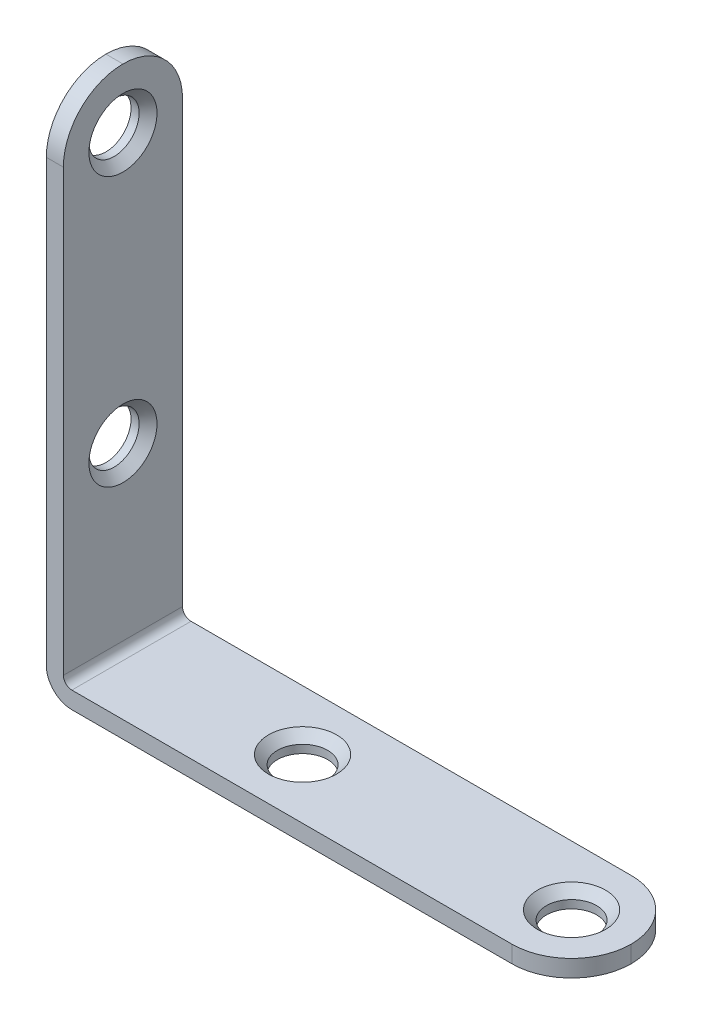
ISO-10303-21;
HEADER;
FILE_DESCRIPTION(('STEP AP214'),'2;1');
FILE_NAME('part.step','',(''),(''),'','','');
FILE_SCHEMA(('AUTOMOTIVE_DESIGN { 1 0 10303 214 1 1 1 1 }'));
ENDSEC;
DATA;
#1=APPLICATION_CONTEXT('core data for automotive mechanical design processes');
#2=APPLICATION_PROTOCOL_DEFINITION('international standard','automotive_design',2000,#1);
#3=PRODUCT_CONTEXT('',#1,'mechanical');
#4=PRODUCT('Part','Part','',(#3));
#5=PRODUCT_RELATED_PRODUCT_CATEGORY('part','',(#4));
#6=PRODUCT_DEFINITION_FORMATION('','',#4);
#7=PRODUCT_DEFINITION_CONTEXT('part definition',#1,'design');
#8=PRODUCT_DEFINITION('design','',#6,#7);
#9=PRODUCT_DEFINITION_SHAPE('','',#8);
#10=(LENGTH_UNIT() NAMED_UNIT(*) SI_UNIT(.MILLI.,.METRE.));
#11=(NAMED_UNIT(*) PLANE_ANGLE_UNIT() SI_UNIT($,.RADIAN.));
#12=(NAMED_UNIT(*) SI_UNIT($,.STERADIAN.) SOLID_ANGLE_UNIT());
#13=UNCERTAINTY_MEASURE_WITH_UNIT(LENGTH_MEASURE(1.E-05),#10,'distance_accuracy_value','');
#14=(GEOMETRIC_REPRESENTATION_CONTEXT(3) GLOBAL_UNCERTAINTY_ASSIGNED_CONTEXT((#13)) GLOBAL_UNIT_ASSIGNED_CONTEXT((#10,
#11,#12)) REPRESENTATION_CONTEXT('',''));
#15=CARTESIAN_POINT('',(0.,0.,0.));
#16=DIRECTION('',(0.,0.,1.));
#17=DIRECTION('',(1.,0.,0.));
#18=AXIS2_PLACEMENT_3D('',#15,#16,#17);
#19=CARTESIAN_POINT('',(2.,3.00000000000001,7.));
#20=DIRECTION('',(-1.,0.,0.));
#21=DIRECTION('',(0.,0.,1.));
#22=AXIS2_PLACEMENT_3D('',#19,#20,#21);
#23=PLANE('',#22);
#24=CARTESIAN_POINT('',(2.,54.7,0.));
#25=DIRECTION('',(1.,0.,0.));
#26=DIRECTION('',(0.,0.,-1.));
#27=AXIS2_PLACEMENT_3D('',#24,#25,#26);
#28=CIRCLE('',#27,4.);
#29=CARTESIAN_POINT('',(2.,54.7,-4.));
#30=VERTEX_POINT('',#29);
#31=EDGE_CURVE('E237',#30,#30,#28,.T.);
#32=ORIENTED_EDGE('',*,*,#31,.F.);
#33=EDGE_LOOP('',(#32));
#34=FACE_BOUND('',#33,.T.);
#35=DIRECTION('',(0.,1.,0.));
#36=VECTOR('',#35,1.);
#37=CARTESIAN_POINT('',(2.,3.00000000000001,-7.));
#38=LINE('',#37,#36);
#39=CARTESIAN_POINT('',(2.,3.00000000000001,-7.));
#40=VERTEX_POINT('',#39);
#41=CARTESIAN_POINT('',(2.,54.7,-7.));
#42=VERTEX_POINT('',#41);
#43=EDGE_CURVE('E131',#40,#42,#38,.T.);
#44=ORIENTED_EDGE('',*,*,#43,.T.);
#45=CARTESIAN_POINT('',(2.,54.7,0.));
#46=DIRECTION('',(-1.,0.,0.));
#47=DIRECTION('',(0.,0.,1.));
#48=AXIS2_PLACEMENT_3D('',#45,#46,#47);
#49=CIRCLE('',#48,7.);
#50=CARTESIAN_POINT('',(2.,61.7,0.));
#51=VERTEX_POINT('',#50);
#52=EDGE_CURVE('E13',#42,#51,#49,.F.);
#53=ORIENTED_EDGE('',*,*,#52,.T.);
#54=CARTESIAN_POINT('',(2.,54.7,0.));
#55=DIRECTION('',(-1.,0.,0.));
#56=DIRECTION('',(0.,0.,1.));
#57=AXIS2_PLACEMENT_3D('',#54,#55,#56);
#58=CIRCLE('',#57,7.);
#59=CARTESIAN_POINT('',(2.,54.7,7.));
#60=VERTEX_POINT('',#59);
#61=EDGE_CURVE('E54',#51,#60,#58,.F.);
#62=ORIENTED_EDGE('',*,*,#61,.T.);
#63=DIRECTION('',(0.,1.,0.));
#64=VECTOR('',#63,1.);
#65=CARTESIAN_POINT('',(2.,3.00000000000001,7.));
#66=LINE('',#65,#64);
#67=CARTESIAN_POINT('',(2.,3.00000000000001,7.));
#68=VERTEX_POINT('',#67);
#69=EDGE_CURVE('E155',#68,#60,#66,.T.);
#70=ORIENTED_EDGE('',*,*,#69,.F.);
#71=DIRECTION('',(0.,0.,-1.));
#72=VECTOR('',#71,1.);
#73=CARTESIAN_POINT('',(2.,3.00000000000001,7.));
#74=LINE('',#73,#72);
#75=EDGE_CURVE('E157',#68,#40,#74,.T.);
#76=ORIENTED_EDGE('',*,*,#75,.T.);
#77=EDGE_LOOP('',(#44,#53,#62,#70,#76));
#78=FACE_BOUND('',#77,.T.);
#79=CARTESIAN_POINT('',(2.,23.1,0.));
#80=DIRECTION('',(1.,0.,0.));
#81=DIRECTION('',(0.,0.,-1.));
#82=AXIS2_PLACEMENT_3D('',#79,#80,#81);
#83=CIRCLE('',#82,4.);
#84=CARTESIAN_POINT('',(2.,23.1,-4.));
#85=VERTEX_POINT('',#84);
#86=EDGE_CURVE('E228',#85,#85,#83,.T.);
#87=ORIENTED_EDGE('',*,*,#86,.F.);
#88=EDGE_LOOP('',(#87));
#89=FACE_BOUND('',#88,.T.);
#90=ADVANCED_FACE('F45',(#34,#78,#89),#23,.F.);
#91=CARTESIAN_POINT('',(0.,3.00000000000002,7.));
#92=DIRECTION('',(1.,0.,0.));
#93=DIRECTION('',(0.,0.,-1.));
#94=AXIS2_PLACEMENT_3D('',#91,#92,#93);
#95=PLANE('',#94);
#96=CARTESIAN_POINT('',(0.,54.7,0.));
#97=DIRECTION('',(1.,0.,0.));
#98=DIRECTION('',(0.,0.,-1.));
#99=AXIS2_PLACEMENT_3D('',#96,#97,#98);
#100=CIRCLE('',#99,2.95);
#101=CARTESIAN_POINT('',(0.,54.7,-2.95));
#102=VERTEX_POINT('',#101);
#103=EDGE_CURVE('E231',#102,#102,#100,.T.);
#104=ORIENTED_EDGE('',*,*,#103,.T.);
#105=EDGE_LOOP('',(#104));
#106=FACE_BOUND('',#105,.T.);
#107=CARTESIAN_POINT('',(0.,23.1,0.));
#108=DIRECTION('',(1.,0.,0.));
#109=DIRECTION('',(0.,0.,-1.));
#110=AXIS2_PLACEMENT_3D('',#107,#108,#109);
#111=CIRCLE('',#110,2.95);
#112=CARTESIAN_POINT('',(0.,23.1,-2.95000000000001));
#113=VERTEX_POINT('',#112);
#114=EDGE_CURVE('E222',#113,#113,#111,.T.);
#115=ORIENTED_EDGE('',*,*,#114,.T.);
#116=EDGE_LOOP('',(#115));
#117=FACE_BOUND('',#116,.T.);
#118=CARTESIAN_POINT('',(0.,54.7,0.));
#119=DIRECTION('',(1.,0.,0.));
#120=DIRECTION('',(0.,0.,-1.));
#121=AXIS2_PLACEMENT_3D('',#118,#119,#120);
#122=CIRCLE('',#121,7.);
#123=CARTESIAN_POINT('',(0.,54.7,7.));
#124=VERTEX_POINT('',#123);
#125=CARTESIAN_POINT('',(0.,61.7,0.));
#126=VERTEX_POINT('',#125);
#127=EDGE_CURVE('E68',#124,#126,#122,.F.);
#128=ORIENTED_EDGE('',*,*,#127,.T.);
#129=CARTESIAN_POINT('',(0.,54.7,0.));
#130=DIRECTION('',(1.,0.,0.));
#131=DIRECTION('',(0.,0.,-1.));
#132=AXIS2_PLACEMENT_3D('',#129,#130,#131);
#133=CIRCLE('',#132,7.);
#134=CARTESIAN_POINT('',(0.,54.7,-7.));
#135=VERTEX_POINT('',#134);
#136=EDGE_CURVE('E193',#126,#135,#133,.F.);
#137=ORIENTED_EDGE('',*,*,#136,.T.);
#138=DIRECTION('',(0.,-1.,0.));
#139=VECTOR('',#138,1.);
#140=CARTESIAN_POINT('',(0.,3.00000000000002,-7.));
#141=LINE('',#140,#139);
#142=CARTESIAN_POINT('',(0.,3.00000000000002,-7.));
#143=VERTEX_POINT('',#142);
#144=EDGE_CURVE('E137',#135,#143,#141,.T.);
#145=ORIENTED_EDGE('',*,*,#144,.T.);
#146=DIRECTION('',(0.,0.,-1.));
#147=VECTOR('',#146,1.);
#148=CARTESIAN_POINT('',(0.,3.00000000000002,7.));
#149=LINE('',#148,#147);
#150=CARTESIAN_POINT('',(0.,3.00000000000002,7.));
#151=VERTEX_POINT('',#150);
#152=EDGE_CURVE('E134',#151,#143,#149,.T.);
#153=ORIENTED_EDGE('',*,*,#152,.F.);
#154=DIRECTION('',(0.,-1.,0.));
#155=VECTOR('',#154,1.);
#156=CARTESIAN_POINT('',(0.,3.00000000000002,7.));
#157=LINE('',#156,#155);
#158=EDGE_CURVE('E121',#124,#151,#157,.T.);
#159=ORIENTED_EDGE('',*,*,#158,.F.);
#160=EDGE_LOOP('',(#128,#137,#145,#153,#159));
#161=FACE_BOUND('',#160,.T.);
#162=ADVANCED_FACE('F135',(#106,#117,#161),#95,.F.);
#163=CARTESIAN_POINT('',(3.,3.,7.));
#164=DIRECTION('',(0.,0.,-1.));
#165=DIRECTION('',(-1.,0.,0.));
#166=AXIS2_PLACEMENT_3D('',#163,#164,#165);
#167=CYLINDRICAL_SURFACE('',#166,3.);
#168=CARTESIAN_POINT('',(3.,3.,-7.));
#169=DIRECTION('',(0.,0.,1.));
#170=DIRECTION('',(1.,0.,0.));
#171=AXIS2_PLACEMENT_3D('',#168,#169,#170);
#172=CIRCLE('',#171,3.);
#173=CARTESIAN_POINT('',(3.00000000000002,0.,-7.));
#174=VERTEX_POINT('',#173);
#175=EDGE_CURVE('E159',#143,#174,#172,.T.);
#176=ORIENTED_EDGE('',*,*,#175,.T.);
#177=DIRECTION('',(0.,0.,-1.));
#178=VECTOR('',#177,1.);
#179=CARTESIAN_POINT('',(3.00000000000002,0.,7.));
#180=LINE('',#179,#178);
#181=CARTESIAN_POINT('',(3.00000000000002,0.,7.));
#182=VERTEX_POINT('',#181);
#183=EDGE_CURVE('E141',#182,#174,#180,.T.);
#184=ORIENTED_EDGE('',*,*,#183,.F.);
#185=CARTESIAN_POINT('',(3.,3.,7.));
#186=DIRECTION('',(0.,0.,1.));
#187=DIRECTION('',(1.,0.,0.));
#188=AXIS2_PLACEMENT_3D('',#185,#186,#187);
#189=CIRCLE('',#188,3.);
#190=EDGE_CURVE('E126',#151,#182,#189,.T.);
#191=ORIENTED_EDGE('',*,*,#190,.F.);
#192=ORIENTED_EDGE('',*,*,#152,.T.);
#193=EDGE_LOOP('',(#176,#184,#191,#192));
#194=FACE_BOUND('',#193,.T.);
#195=ADVANCED_FACE('F143',(#194),#167,.T.);
#196=CARTESIAN_POINT('',(3.00000000000002,0.,7.));
#197=DIRECTION('',(0.,1.,0.));
#198=DIRECTION('',(0.,0.,1.));
#199=AXIS2_PLACEMENT_3D('',#196,#197,#198);
#200=PLANE('',#199);
#201=CARTESIAN_POINT('',(54.7,0.,0.));
#202=DIRECTION('',(0.,1.,0.));
#203=DIRECTION('',(0.,0.,1.));
#204=AXIS2_PLACEMENT_3D('',#201,#202,#203);
#205=CIRCLE('',#204,2.95);
#206=CARTESIAN_POINT('',(54.7,0.,2.95));
#207=VERTEX_POINT('',#206);
#208=EDGE_CURVE('E213',#207,#207,#205,.T.);
#209=ORIENTED_EDGE('',*,*,#208,.T.);
#210=EDGE_LOOP('',(#209));
#211=FACE_BOUND('',#210,.T.);
#212=CARTESIAN_POINT('',(23.1,0.,0.));
#213=DIRECTION('',(0.,1.,0.));
#214=DIRECTION('',(0.,0.,1.));
#215=AXIS2_PLACEMENT_3D('',#212,#213,#214);
#216=CIRCLE('',#215,2.95);
#217=CARTESIAN_POINT('',(23.1,0.,2.95000000000001));
#218=VERTEX_POINT('',#217);
#219=EDGE_CURVE('E200',#218,#218,#216,.T.);
#220=ORIENTED_EDGE('',*,*,#219,.T.);
#221=EDGE_LOOP('',(#220));
#222=FACE_BOUND('',#221,.T.);
#223=DIRECTION('',(1.,0.,0.));
#224=VECTOR('',#223,1.);
#225=CARTESIAN_POINT('',(3.00000000000002,0.,-7.));
#226=LINE('',#225,#224);
#227=CARTESIAN_POINT('',(54.7,0.,-7.));
#228=VERTEX_POINT('',#227);
#229=EDGE_CURVE('E162',#174,#228,#226,.T.);
#230=ORIENTED_EDGE('',*,*,#229,.T.);
#231=CARTESIAN_POINT('',(54.7,0.,0.));
#232=DIRECTION('',(0.,1.,0.));
#233=DIRECTION('',(0.,0.,1.));
#234=AXIS2_PLACEMENT_3D('',#231,#232,#233);
#235=CIRCLE('',#234,7.);
#236=CARTESIAN_POINT('',(61.7,0.,0.));
#237=VERTEX_POINT('',#236);
#238=EDGE_CURVE('E187',#228,#237,#235,.F.);
#239=ORIENTED_EDGE('',*,*,#238,.T.);
#240=CARTESIAN_POINT('',(54.7,0.,0.));
#241=DIRECTION('',(0.,1.,0.));
#242=DIRECTION('',(0.,0.,1.));
#243=AXIS2_PLACEMENT_3D('',#240,#241,#242);
#244=CIRCLE('',#243,7.);
#245=CARTESIAN_POINT('',(54.7,0.,7.));
#246=VERTEX_POINT('',#245);
#247=EDGE_CURVE('E185',#237,#246,#244,.F.);
#248=ORIENTED_EDGE('',*,*,#247,.T.);
#249=DIRECTION('',(1.,0.,0.));
#250=VECTOR('',#249,1.);
#251=CARTESIAN_POINT('',(3.00000000000002,0.,7.));
#252=LINE('',#251,#250);
#253=EDGE_CURVE('E146',#182,#246,#252,.T.);
#254=ORIENTED_EDGE('',*,*,#253,.F.);
#255=ORIENTED_EDGE('',*,*,#183,.T.);
#256=EDGE_LOOP('',(#230,#239,#248,#254,#255));
#257=FACE_BOUND('',#256,.T.);
#258=ADVANCED_FACE('F297',(#211,#222,#257),#200,.F.);
#259=CARTESIAN_POINT('',(3.00000000000002,2.,7.));
#260=DIRECTION('',(0.,-1.,0.));
#261=DIRECTION('',(0.,0.,-1.));
#262=AXIS2_PLACEMENT_3D('',#259,#260,#261);
#263=PLANE('',#262);
#264=CARTESIAN_POINT('',(54.7,2.,0.));
#265=DIRECTION('',(0.,1.,0.));
#266=DIRECTION('',(0.,0.,1.));
#267=AXIS2_PLACEMENT_3D('',#264,#265,#266);
#268=CIRCLE('',#267,4.);
#269=CARTESIAN_POINT('',(54.7,2.,4.));
#270=VERTEX_POINT('',#269);
#271=EDGE_CURVE('E219',#270,#270,#268,.T.);
#272=ORIENTED_EDGE('',*,*,#271,.F.);
#273=EDGE_LOOP('',(#272));
#274=FACE_BOUND('',#273,.T.);
#275=CARTESIAN_POINT('',(23.1,2.,0.));
#276=DIRECTION('',(0.,1.,0.));
#277=DIRECTION('',(0.,0.,1.));
#278=AXIS2_PLACEMENT_3D('',#275,#276,#277);
#279=CIRCLE('',#278,4.);
#280=CARTESIAN_POINT('',(23.1,2.,4.));
#281=VERTEX_POINT('',#280);
#282=EDGE_CURVE('E208',#281,#281,#279,.T.);
#283=ORIENTED_EDGE('',*,*,#282,.F.);
#284=EDGE_LOOP('',(#283));
#285=FACE_BOUND('',#284,.T.);
#286=CARTESIAN_POINT('',(54.7,2.,0.));
#287=DIRECTION('',(0.,-1.,0.));
#288=DIRECTION('',(0.,0.,-1.));
#289=AXIS2_PLACEMENT_3D('',#286,#287,#288);
#290=CIRCLE('',#289,7.);
#291=CARTESIAN_POINT('',(54.7,2.,7.));
#292=VERTEX_POINT('',#291);
#293=CARTESIAN_POINT('',(61.7,2.,0.));
#294=VERTEX_POINT('',#293);
#295=EDGE_CURVE('E140',#292,#294,#290,.F.);
#296=ORIENTED_EDGE('',*,*,#295,.T.);
#297=CARTESIAN_POINT('',(54.7,2.,0.));
#298=DIRECTION('',(0.,-1.,0.));
#299=DIRECTION('',(0.,0.,-1.));
#300=AXIS2_PLACEMENT_3D('',#297,#298,#299);
#301=CIRCLE('',#300,7.);
#302=CARTESIAN_POINT('',(54.7,2.,-7.));
#303=VERTEX_POINT('',#302);
#304=EDGE_CURVE('E177',#294,#303,#301,.F.);
#305=ORIENTED_EDGE('',*,*,#304,.T.);
#306=DIRECTION('',(-1.,0.,0.));
#307=VECTOR('',#306,1.);
#308=CARTESIAN_POINT('',(3.00000000000002,2.,-7.));
#309=LINE('',#308,#307);
#310=CARTESIAN_POINT('',(3.00000000000002,2.,-7.));
#311=VERTEX_POINT('',#310);
#312=EDGE_CURVE('E165',#303,#311,#309,.T.);
#313=ORIENTED_EDGE('',*,*,#312,.T.);
#314=DIRECTION('',(0.,0.,-1.));
#315=VECTOR('',#314,1.);
#316=CARTESIAN_POINT('',(3.00000000000002,2.,7.));
#317=LINE('',#316,#315);
#318=CARTESIAN_POINT('',(3.00000000000002,2.,7.));
#319=VERTEX_POINT('',#318);
#320=EDGE_CURVE('E172',#319,#311,#317,.T.);
#321=ORIENTED_EDGE('',*,*,#320,.F.);
#322=DIRECTION('',(-1.,0.,0.));
#323=VECTOR('',#322,1.);
#324=CARTESIAN_POINT('',(3.00000000000002,2.,7.));
#325=LINE('',#324,#323);
#326=EDGE_CURVE('E148',#292,#319,#325,.T.);
#327=ORIENTED_EDGE('',*,*,#326,.F.);
#328=EDGE_LOOP('',(#296,#305,#313,#321,#327));
#329=FACE_BOUND('',#328,.T.);
#330=ADVANCED_FACE('F293',(#274,#285,#329),#263,.F.);
#331=CARTESIAN_POINT('',(3.,3.,7.));
#332=DIRECTION('',(0.,0.,-1.));
#333=DIRECTION('',(-1.,0.,0.));
#334=AXIS2_PLACEMENT_3D('',#331,#332,#333);
#335=CYLINDRICAL_SURFACE('',#334,1.);
#336=CARTESIAN_POINT('',(3.,3.,-7.));
#337=DIRECTION('',(0.,0.,-1.));
#338=DIRECTION('',(1.,0.,0.));
#339=AXIS2_PLACEMENT_3D('',#336,#337,#338);
#340=CIRCLE('',#339,1.);
#341=EDGE_CURVE('E167',#311,#40,#340,.T.);
#342=ORIENTED_EDGE('',*,*,#341,.T.);
#343=ORIENTED_EDGE('',*,*,#75,.F.);
#344=CARTESIAN_POINT('',(3.,3.,7.));
#345=DIRECTION('',(0.,0.,-1.));
#346=DIRECTION('',(1.,0.,0.));
#347=AXIS2_PLACEMENT_3D('',#344,#345,#346);
#348=CIRCLE('',#347,1.);
#349=EDGE_CURVE('E153',#319,#68,#348,.T.);
#350=ORIENTED_EDGE('',*,*,#349,.F.);
#351=ORIENTED_EDGE('',*,*,#320,.T.);
#352=EDGE_LOOP('',(#342,#343,#350,#351));
#353=FACE_BOUND('',#352,.T.);
#354=ADVANCED_FACE('F286',(#353),#335,.F.);
#355=CARTESIAN_POINT('',(3.,3.,7.));
#356=DIRECTION('',(0.,0.,1.));
#357=DIRECTION('',(1.,0.,0.));
#358=AXIS2_PLACEMENT_3D('',#355,#356,#357);
#359=PLANE('',#358);
#360=ORIENTED_EDGE('',*,*,#253,.T.);
#361=DIRECTION('',(0.,1.,0.));
#362=VECTOR('',#361,1.);
#363=CARTESIAN_POINT('',(54.7,2.,7.));
#364=LINE('',#363,#362);
#365=EDGE_CURVE('E190',#246,#292,#364,.T.);
#366=ORIENTED_EDGE('',*,*,#365,.T.);
#367=ORIENTED_EDGE('',*,*,#326,.T.);
#368=ORIENTED_EDGE('',*,*,#349,.T.);
#369=ORIENTED_EDGE('',*,*,#69,.T.);
#370=DIRECTION('',(-1.,0.,0.));
#371=VECTOR('',#370,1.);
#372=CARTESIAN_POINT('',(0.,54.7,7.));
#373=LINE('',#372,#371);
#374=EDGE_CURVE('E130',#60,#124,#373,.T.);
#375=ORIENTED_EDGE('',*,*,#374,.T.);
#376=ORIENTED_EDGE('',*,*,#158,.T.);
#377=ORIENTED_EDGE('',*,*,#190,.T.);
#378=EDGE_LOOP('',(#360,#366,#367,#368,#369,#375,#376,#377));
#379=FACE_BOUND('',#378,.T.);
#380=ADVANCED_FACE('F124',(#379),#359,.T.);
#381=CARTESIAN_POINT('',(3.,3.,-7.));
#382=DIRECTION('',(0.,0.,1.));
#383=DIRECTION('',(1.,0.,0.));
#384=AXIS2_PLACEMENT_3D('',#381,#382,#383);
#385=PLANE('',#384);
#386=ORIENTED_EDGE('',*,*,#312,.F.);
#387=DIRECTION('',(0.,1.,0.));
#388=VECTOR('',#387,1.);
#389=CARTESIAN_POINT('',(54.7,3.,-7.));
#390=LINE('',#389,#388);
#391=EDGE_CURVE('E182',#303,#228,#390,.F.);
#392=ORIENTED_EDGE('',*,*,#391,.T.);
#393=ORIENTED_EDGE('',*,*,#229,.F.);
#394=ORIENTED_EDGE('',*,*,#175,.F.);
#395=ORIENTED_EDGE('',*,*,#144,.F.);
#396=DIRECTION('',(-1.,0.,0.));
#397=VECTOR('',#396,1.);
#398=CARTESIAN_POINT('',(3.,54.7,-7.));
#399=LINE('',#398,#397);
#400=EDGE_CURVE('E179',#135,#42,#399,.F.);
#401=ORIENTED_EDGE('',*,*,#400,.T.);
#402=ORIENTED_EDGE('',*,*,#43,.F.);
#403=ORIENTED_EDGE('',*,*,#341,.F.);
#404=EDGE_LOOP('',(#386,#392,#393,#394,#395,#401,#402,#403));
#405=FACE_BOUND('',#404,.T.);
#406=ADVANCED_FACE('F285',(#405),#385,.F.);
#407=CARTESIAN_POINT('',(54.7,3.,0.));
#408=DIRECTION('',(0.,-1.,0.));
#409=DIRECTION('',(0.,0.,-1.));
#410=AXIS2_PLACEMENT_3D('',#407,#408,#409);
#411=CYLINDRICAL_SURFACE('',#410,7.);
#412=ORIENTED_EDGE('',*,*,#365,.F.);
#413=ORIENTED_EDGE('',*,*,#247,.F.);
#414=DIRECTION('',(0.,1.,0.));
#415=VECTOR('',#414,1.);
#416=CARTESIAN_POINT('',(61.7,0.,0.));
#417=LINE('',#416,#415);
#418=EDGE_CURVE('E160',#294,#237,#417,.F.);
#419=ORIENTED_EDGE('',*,*,#418,.F.);
#420=ORIENTED_EDGE('',*,*,#295,.F.);
#421=EDGE_LOOP('',(#412,#413,#419,#420));
#422=FACE_BOUND('',#421,.T.);
#423=ADVANCED_FACE('F288',(#422),#411,.T.);
#424=CARTESIAN_POINT('',(54.7,2.,0.));
#425=DIRECTION('',(0.,1.,0.));
#426=DIRECTION('',(0.,0.,1.));
#427=AXIS2_PLACEMENT_3D('',#424,#425,#426);
#428=CYLINDRICAL_SURFACE('',#427,7.);
#429=ORIENTED_EDGE('',*,*,#238,.F.);
#430=ORIENTED_EDGE('',*,*,#391,.F.);
#431=ORIENTED_EDGE('',*,*,#304,.F.);
#432=ORIENTED_EDGE('',*,*,#418,.T.);
#433=EDGE_LOOP('',(#429,#430,#431,#432));
#434=FACE_BOUND('',#433,.T.);
#435=ADVANCED_FACE('F307',(#434),#428,.T.);
#436=CARTESIAN_POINT('',(3.,54.7,0.));
#437=DIRECTION('',(1.,0.,0.));
#438=DIRECTION('',(0.,0.,-1.));
#439=AXIS2_PLACEMENT_3D('',#436,#437,#438);
#440=CYLINDRICAL_SURFACE('',#439,7.);
#441=ORIENTED_EDGE('',*,*,#374,.F.);
#442=ORIENTED_EDGE('',*,*,#61,.F.);
#443=DIRECTION('',(-1.,0.,0.));
#444=VECTOR('',#443,1.);
#445=CARTESIAN_POINT('',(2.,61.7,0.));
#446=LINE('',#445,#444);
#447=EDGE_CURVE('E49',#126,#51,#446,.F.);
#448=ORIENTED_EDGE('',*,*,#447,.F.);
#449=ORIENTED_EDGE('',*,*,#127,.F.);
#450=EDGE_LOOP('',(#441,#442,#448,#449));
#451=FACE_BOUND('',#450,.T.);
#452=ADVANCED_FACE('F47',(#451),#440,.T.);
#453=CARTESIAN_POINT('',(0.,54.7,0.));
#454=DIRECTION('',(-1.,0.,0.));
#455=DIRECTION('',(0.,0.,1.));
#456=AXIS2_PLACEMENT_3D('',#453,#454,#455);
#457=CYLINDRICAL_SURFACE('',#456,7.);
#458=ORIENTED_EDGE('',*,*,#52,.F.);
#459=ORIENTED_EDGE('',*,*,#400,.F.);
#460=ORIENTED_EDGE('',*,*,#136,.F.);
#461=ORIENTED_EDGE('',*,*,#447,.T.);
#462=EDGE_LOOP('',(#458,#459,#460,#461));
#463=FACE_BOUND('',#462,.T.);
#464=ADVANCED_FACE('F281',(#463),#457,.T.);
#465=CARTESIAN_POINT('',(23.1,2.,0.));
#466=DIRECTION('',(0.,1.,0.));
#467=DIRECTION('',(0.,0.,1.));
#468=AXIS2_PLACEMENT_3D('',#465,#466,#467);
#469=CYLINDRICAL_SURFACE('',#468,2.95);
#470=ORIENTED_EDGE('',*,*,#219,.F.);
#471=EDGE_LOOP('',(#470));
#472=FACE_BOUND('',#471,.T.);
#473=CARTESIAN_POINT('',(23.1,0.95,0.));
#474=DIRECTION('',(0.,1.,0.));
#475=DIRECTION('',(0.,0.,1.));
#476=AXIS2_PLACEMENT_3D('',#473,#474,#475);
#477=CIRCLE('',#476,2.95);
#478=CARTESIAN_POINT('',(23.1,0.95,2.95000000000001));
#479=VERTEX_POINT('',#478);
#480=EDGE_CURVE('E204',#479,#479,#477,.T.);
#481=ORIENTED_EDGE('',*,*,#480,.T.);
#482=EDGE_LOOP('',(#481));
#483=FACE_BOUND('',#482,.T.);
#484=ADVANCED_FACE('F277',(#472,#483),#469,.F.);
#485=CARTESIAN_POINT('',(23.1,2.,0.));
#486=DIRECTION('',(0.,1.,0.));
#487=DIRECTION('',(0.,0.,1.));
#488=AXIS2_PLACEMENT_3D('',#485,#486,#487);
#489=CONICAL_SURFACE('',#488,4.,0.785398163397448);
#490=ORIENTED_EDGE('',*,*,#480,.F.);
#491=EDGE_LOOP('',(#490));
#492=FACE_BOUND('',#491,.T.);
#493=ORIENTED_EDGE('',*,*,#282,.T.);
#494=EDGE_LOOP('',(#493));
#495=FACE_BOUND('',#494,.T.);
#496=ADVANCED_FACE('F273',(#492,#495),#489,.F.);
#497=CARTESIAN_POINT('',(54.7,2.,0.));
#498=DIRECTION('',(0.,1.,0.));
#499=DIRECTION('',(0.,0.,1.));
#500=AXIS2_PLACEMENT_3D('',#497,#498,#499);
#501=CYLINDRICAL_SURFACE('',#500,2.95);
#502=ORIENTED_EDGE('',*,*,#208,.F.);
#503=EDGE_LOOP('',(#502));
#504=FACE_BOUND('',#503,.T.);
#505=CARTESIAN_POINT('',(54.7,0.95,0.));
#506=DIRECTION('',(0.,1.,0.));
#507=DIRECTION('',(0.,0.,1.));
#508=AXIS2_PLACEMENT_3D('',#505,#506,#507);
#509=CIRCLE('',#508,2.95);
#510=CARTESIAN_POINT('',(54.7,0.95,2.95));
#511=VERTEX_POINT('',#510);
#512=EDGE_CURVE('E216',#511,#511,#509,.T.);
#513=ORIENTED_EDGE('',*,*,#512,.T.);
#514=EDGE_LOOP('',(#513));
#515=FACE_BOUND('',#514,.T.);
#516=ADVANCED_FACE('F269',(#504,#515),#501,.F.);
#517=CARTESIAN_POINT('',(54.7,2.,0.));
#518=DIRECTION('',(0.,1.,0.));
#519=DIRECTION('',(0.,0.,1.));
#520=AXIS2_PLACEMENT_3D('',#517,#518,#519);
#521=CONICAL_SURFACE('',#520,4.,0.785398163397446);
#522=ORIENTED_EDGE('',*,*,#512,.F.);
#523=EDGE_LOOP('',(#522));
#524=FACE_BOUND('',#523,.T.);
#525=ORIENTED_EDGE('',*,*,#271,.T.);
#526=EDGE_LOOP('',(#525));
#527=FACE_BOUND('',#526,.T.);
#528=ADVANCED_FACE('F261',(#524,#527),#521,.F.);
#529=CARTESIAN_POINT('',(2.,23.1,0.));
#530=DIRECTION('',(1.,0.,0.));
#531=DIRECTION('',(0.,0.,-1.));
#532=AXIS2_PLACEMENT_3D('',#529,#530,#531);
#533=CYLINDRICAL_SURFACE('',#532,2.95);
#534=ORIENTED_EDGE('',*,*,#114,.F.);
#535=EDGE_LOOP('',(#534));
#536=FACE_BOUND('',#535,.T.);
#537=CARTESIAN_POINT('',(0.950000000000001,23.1,0.));
#538=DIRECTION('',(1.,0.,0.));
#539=DIRECTION('',(0.,0.,-1.));
#540=AXIS2_PLACEMENT_3D('',#537,#538,#539);
#541=CIRCLE('',#540,2.95);
#542=CARTESIAN_POINT('',(0.950000000000001,23.1,-2.95000000000001));
#543=VERTEX_POINT('',#542);
#544=EDGE_CURVE('E225',#543,#543,#541,.T.);
#545=ORIENTED_EDGE('',*,*,#544,.T.);
#546=EDGE_LOOP('',(#545));
#547=FACE_BOUND('',#546,.T.);
#548=ADVANCED_FACE('F252',(#536,#547),#533,.F.);
#549=CARTESIAN_POINT('',(2.,23.1,0.));
#550=DIRECTION('',(1.,0.,0.));
#551=DIRECTION('',(0.,0.,-1.));
#552=AXIS2_PLACEMENT_3D('',#549,#550,#551);
#553=CONICAL_SURFACE('',#552,4.,0.785398163397448);
#554=ORIENTED_EDGE('',*,*,#544,.F.);
#555=EDGE_LOOP('',(#554));
#556=FACE_BOUND('',#555,.T.);
#557=ORIENTED_EDGE('',*,*,#86,.T.);
#558=EDGE_LOOP('',(#557));
#559=FACE_BOUND('',#558,.T.);
#560=ADVANCED_FACE('F249',(#556,#559),#553,.F.);
#561=CARTESIAN_POINT('',(2.,54.7,0.));
#562=DIRECTION('',(1.,0.,0.));
#563=DIRECTION('',(0.,0.,-1.));
#564=AXIS2_PLACEMENT_3D('',#561,#562,#563);
#565=CYLINDRICAL_SURFACE('',#564,2.95);
#566=ORIENTED_EDGE('',*,*,#103,.F.);
#567=EDGE_LOOP('',(#566));
#568=FACE_BOUND('',#567,.T.);
#569=CARTESIAN_POINT('',(0.950000000000001,54.7,0.));
#570=DIRECTION('',(1.,0.,0.));
#571=DIRECTION('',(0.,0.,-1.));
#572=AXIS2_PLACEMENT_3D('',#569,#570,#571);
#573=CIRCLE('',#572,2.95);
#574=CARTESIAN_POINT('',(0.950000000000001,54.7,-2.95));
#575=VERTEX_POINT('',#574);
#576=EDGE_CURVE('E234',#575,#575,#573,.T.);
#577=ORIENTED_EDGE('',*,*,#576,.T.);
#578=EDGE_LOOP('',(#577));
#579=FACE_BOUND('',#578,.T.);
#580=ADVANCED_FACE('F251',(#568,#579),#565,.F.);
#581=CARTESIAN_POINT('',(2.,54.7,0.));
#582=DIRECTION('',(1.,0.,0.));
#583=DIRECTION('',(0.,0.,-1.));
#584=AXIS2_PLACEMENT_3D('',#581,#582,#583);
#585=CONICAL_SURFACE('',#584,4.,0.785398163397447);
#586=ORIENTED_EDGE('',*,*,#576,.F.);
#587=EDGE_LOOP('',(#586));
#588=FACE_BOUND('',#587,.T.);
#589=ORIENTED_EDGE('',*,*,#31,.T.);
#590=EDGE_LOOP('',(#589));
#591=FACE_BOUND('',#590,.T.);
#592=ADVANCED_FACE('F241',(#588,#591),#585,.F.);
#593=CLOSED_SHELL('',(#90,#162,#195,#258,#330,#354,#380,#406,#423,#435,#452,#464,#484,#496,#516,
#528,#548,#560,#580,#592));
#594=MANIFOLD_SOLID_BREP('B2',#593);
#595=ADVANCED_BREP_SHAPE_REPRESENTATION('',(#18,#594),#14);
#596=SHAPE_DEFINITION_REPRESENTATION(#9,#595);
ENDSEC;
END-ISO-10303-21;
